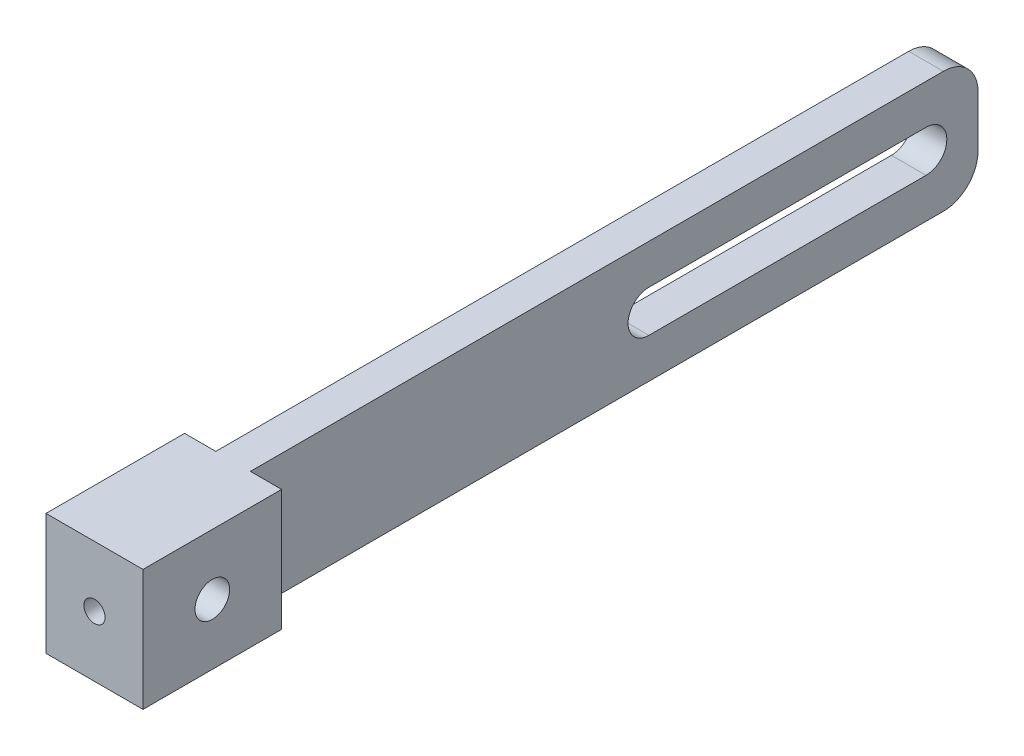
ISO-10303-21;
HEADER;
FILE_DESCRIPTION(('STEP AP214'),'2;1');
FILE_NAME('part.step','',(''),(''),'','','');
FILE_SCHEMA(('AUTOMOTIVE_DESIGN { 1 0 10303 214 1 1 1 1 }'));
ENDSEC;
DATA;
#1=APPLICATION_CONTEXT('core data for automotive mechanical design processes');
#2=APPLICATION_PROTOCOL_DEFINITION('international standard','automotive_design',2000,#1);
#3=PRODUCT_CONTEXT('',#1,'mechanical');
#4=PRODUCT('Part','Part','',(#3));
#5=PRODUCT_RELATED_PRODUCT_CATEGORY('part','',(#4));
#6=PRODUCT_DEFINITION_FORMATION('','',#4);
#7=PRODUCT_DEFINITION_CONTEXT('part definition',#1,'design');
#8=PRODUCT_DEFINITION('design','',#6,#7);
#9=PRODUCT_DEFINITION_SHAPE('','',#8);
#10=(LENGTH_UNIT() NAMED_UNIT(*) SI_UNIT(.MILLI.,.METRE.));
#11=(NAMED_UNIT(*) PLANE_ANGLE_UNIT() SI_UNIT($,.RADIAN.));
#12=(NAMED_UNIT(*) SI_UNIT($,.STERADIAN.) SOLID_ANGLE_UNIT());
#13=UNCERTAINTY_MEASURE_WITH_UNIT(LENGTH_MEASURE(1.E-05),#10,'distance_accuracy_value','');
#14=(GEOMETRIC_REPRESENTATION_CONTEXT(3) GLOBAL_UNCERTAINTY_ASSIGNED_CONTEXT((#13)) GLOBAL_UNIT_ASSIGNED_CONTEXT((#10,
#11,#12)) REPRESENTATION_CONTEXT('',''));
#15=CARTESIAN_POINT('',(0.,0.,0.));
#16=DIRECTION('',(0.,0.,1.));
#17=DIRECTION('',(1.,0.,0.));
#18=AXIS2_PLACEMENT_3D('',#15,#16,#17);
#19=CARTESIAN_POINT('',(0.,0.,-40.));
#20=DIRECTION('',(0.,0.,1.));
#21=DIRECTION('',(1.,0.,0.));
#22=AXIS2_PLACEMENT_3D('',#19,#20,#21);
#23=PLANE('',#22);
#24=DIRECTION('',(0.,-1.,0.));
#25=VECTOR('',#24,1.);
#26=CARTESIAN_POINT('',(5.,17.5,-40.));
#27=LINE('',#26,#25);
#28=CARTESIAN_POINT('',(5.,17.5,-40.));
#29=VERTEX_POINT('',#28);
#30=CARTESIAN_POINT('',(5.,-17.5,-40.));
#31=VERTEX_POINT('',#30);
#32=EDGE_CURVE('E169',#29,#31,#27,.T.);
#33=ORIENTED_EDGE('',*,*,#32,.F.);
#34=DIRECTION('',(-1.,0.,0.));
#35=VECTOR('',#34,1.);
#36=CARTESIAN_POINT('',(-14.,17.5,-40.));
#37=LINE('',#36,#35);
#38=CARTESIAN_POINT('',(14.,17.5,-40.));
#39=VERTEX_POINT('',#38);
#40=EDGE_CURVE('E222',#39,#29,#37,.T.);
#41=ORIENTED_EDGE('',*,*,#40,.F.);
#42=DIRECTION('',(0.,1.,0.));
#43=VECTOR('',#42,1.);
#44=CARTESIAN_POINT('',(14.,17.5,-40.));
#45=LINE('',#44,#43);
#46=CARTESIAN_POINT('',(14.,-17.5,-40.));
#47=VERTEX_POINT('',#46);
#48=EDGE_CURVE('E217',#47,#39,#45,.T.);
#49=ORIENTED_EDGE('',*,*,#48,.F.);
#50=DIRECTION('',(1.,0.,0.));
#51=VECTOR('',#50,1.);
#52=CARTESIAN_POINT('',(-14.,-17.5,-40.));
#53=LINE('',#52,#51);
#54=EDGE_CURVE('E228',#31,#47,#53,.T.);
#55=ORIENTED_EDGE('',*,*,#54,.F.);
#56=EDGE_LOOP('',(#33,#41,#49,#55));
#57=FACE_BOUND('',#56,.T.);
#58=ADVANCED_FACE('F37',(#57),#23,.F.);
#59=CARTESIAN_POINT('',(0.,0.,-40.));
#60=DIRECTION('',(0.,0.,1.));
#61=DIRECTION('',(1.,0.,0.));
#62=AXIS2_PLACEMENT_3D('',#59,#60,#61);
#63=CYLINDRICAL_SURFACE('',#62,3.05);
#64=CARTESIAN_POINT('',(3.05,0.,-25.));
#65=CARTESIAN_POINT('',(3.04999894656967,0.0778388516711993,-24.9999990776582));
#66=CARTESIAN_POINT('',(3.04701357586744,0.155694223240466,-24.9981761128476));
#67=CARTESIAN_POINT('',(3.03512321249011,0.310794901911584,-24.9909373572053));
#68=CARTESIAN_POINT('',(3.02621510973629,0.388039866908199,-24.985519678761));
#69=CARTESIAN_POINT('',(2.99071490170113,0.618203647339813,-24.9640191829666));
#70=CARTESIAN_POINT('',(2.95534719367242,0.769394828397861,-24.9426892638166));
#71=CARTESIAN_POINT('',(2.86329217582679,1.06184403182779,-24.8882091649048));
#72=CARTESIAN_POINT('',(2.80671057271342,1.20314724922889,-24.8551176339032));
#73=CARTESIAN_POINT('',(2.67451304885061,1.47382634240365,-24.7799128481737));
#74=CARTESIAN_POINT('',(2.59890078696826,1.60320450438382,-24.737801327876));
#75=CARTESIAN_POINT('',(2.4242624951777,1.85771546961127,-24.6442100280389));
#76=CARTESIAN_POINT('',(2.32387187455578,1.98173347876208,-24.5922561307158));
#77=CARTESIAN_POINT('',(2.10562192933092,2.21226040779694,-24.4857621209461));
#78=CARTESIAN_POINT('',(1.98773977527488,2.31874605590541,-24.4312186929527));
#79=CARTESIAN_POINT('',(1.72017260685597,2.52499231178169,-24.3174036089768));
#80=CARTESIAN_POINT('',(1.56834873498458,2.62215822454236,-24.2584174550907));
#81=CARTESIAN_POINT('',(1.24706183060992,2.78926152781662,-24.1508950084576));
#82=CARTESIAN_POINT('',(1.07762853689129,2.8592439083724,-24.1023415092093));
#83=CARTESIAN_POINT('',(0.76882879703017,2.95476494598714,-24.0338472934209));
#84=CARTESIAN_POINT('',(0.632459120740937,2.98702727840751,-24.0097941340365));
#85=CARTESIAN_POINT('',(0.354951598144106,3.03252587878817,-23.975503587789));
#86=CARTESIAN_POINT('',(0.213820241570525,3.04578705029111,-23.965248118301));
#87=CARTESIAN_POINT('',(-0.0695169186428372,3.05250587846758,-23.960079848663));
#88=CARTESIAN_POINT('',(-0.211724405724443,3.04591978324775,-23.9652009449729));
#89=CARTESIAN_POINT('',(-0.49261590175361,3.01328022799258,-23.9900548764776));
#90=CARTESIAN_POINT('',(-0.631297101089209,2.98721171847245,-24.0097990073498));
#91=CARTESIAN_POINT('',(-0.899350863065865,2.91762708645337,-24.060695419486));
#92=CARTESIAN_POINT('',(-1.02883998193187,2.87440874414838,-24.0916522481557));
#93=CARTESIAN_POINT('',(-1.27904158300631,2.77215505173565,-24.1616087634001));
#94=CARTESIAN_POINT('',(-1.39975087665567,2.71311399141532,-24.2006113524125));
#95=CARTESIAN_POINT('',(-1.65202957244851,2.56866691324738,-24.290735982823));
#96=CARTESIAN_POINT('',(-1.78165131294036,2.48042947130343,-24.3427763406625));
#97=CARTESIAN_POINT('',(-2.0256128962995,2.28556878071315,-24.448427261534));
#98=CARTESIAN_POINT('',(-2.13993745013053,2.17892737802416,-24.5020393311719));
#99=CARTESIAN_POINT('',(-2.3674687629059,1.93128100554039,-24.6142383852992));
#100=CARTESIAN_POINT('',(-2.47796280565978,1.78752282510817,-24.6723738741415));
#101=CARTESIAN_POINT('',(-2.62415729410356,1.55711280718039,-24.7520579536408));
#102=CARTESIAN_POINT('',(-2.66964759571858,1.47780710253188,-24.7773761234304));
#103=CARTESIAN_POINT('',(-2.75363494715547,1.31468398559502,-24.8248107913834));
#104=CARTESIAN_POINT('',(-2.79213630506512,1.2308693942443,-24.8469292601702));
#105=CARTESIAN_POINT('',(-2.8595753127702,1.06438345561977,-24.8860991069124));
#106=CARTESIAN_POINT('',(-2.88894486907926,0.981939343514416,-24.9033732662594));
#107=CARTESIAN_POINT('',(-2.94062446133058,0.814201359749336,-24.93399826167));
#108=CARTESIAN_POINT('',(-2.9629384997356,0.728909134244006,-24.9473513217917));
#109=CARTESIAN_POINT('',(-3.00015057201688,0.55622461225736,-24.9697264384757));
#110=CARTESIAN_POINT('',(-3.01505450363971,0.468834044124563,-24.9787519391629));
#111=CARTESIAN_POINT('',(-3.0372141666419,0.292772112984459,-24.9922036848332));
#112=CARTESIAN_POINT('',(-3.0444710614773,0.20410094689494,-24.9966306294609));
#113=CARTESIAN_POINT('',(-3.05357958135505,-0.0374310089007928,-25.0021787195112));
#114=CARTESIAN_POINT('',(-3.04783731596421,-0.190780141649155,-24.9986613208267));
#115=CARTESIAN_POINT('',(-3.01362121128961,-0.493851525308604,-24.9778751261289));
#116=CARTESIAN_POINT('',(-2.985148221345,-0.643573911518606,-24.9606068439208));
#117=CARTESIAN_POINT('',(-2.90814523739351,-0.930945744841672,-24.9146605732722));
#118=CARTESIAN_POINT('',(-2.86024135256526,-1.0688224553709,-24.8863397160662));
#119=CARTESIAN_POINT('',(-2.7463652118967,-1.33450083560471,-24.8205669575953));
#120=CARTESIAN_POINT('',(-2.68038962678975,-1.46230064329514,-24.7831133739897));
#121=CARTESIAN_POINT('',(-2.52470605877162,-1.71845326195858,-24.697550024097));
#122=CARTESIAN_POINT('',(-2.43325424821897,-1.84550891661981,-24.6487402116867));
#123=CARTESIAN_POINT('',(-2.23296548945765,-2.08340867478271,-24.5471070384057));
#124=CARTESIAN_POINT('',(-2.12410854289976,-2.19423384550975,-24.4942790977981));
#125=CARTESIAN_POINT('',(-1.87485701591362,-2.41214495906877,-24.3816159904911));
#126=CARTESIAN_POINT('',(-1.73218582108982,-2.51665600033266,-24.3218085480598));
#127=CARTESIAN_POINT('',(-1.42883411005663,-2.70042681573953,-24.2094309196398));
#128=CARTESIAN_POINT('',(-1.26817037069398,-2.7797098526048,-24.1568540918626));
#129=CARTESIAN_POINT('',(-0.967811098808388,-2.89584206509651,-24.0765160823178));
#130=CARTESIAN_POINT('',(-0.831011014232546,-2.93814563830721,-24.045850972745));
#131=CARTESIAN_POINT('',(-0.550685762079174,-3.00331160590618,-23.9977232154527));
#132=CARTESIAN_POINT('',(-0.40717076935868,-3.02620246945419,-23.9802412385693));
#133=CARTESIAN_POINT('',(-0.116589667042718,-3.05127030052332,-23.961063753036));
#134=CARTESIAN_POINT('',(0.0304894511583799,-3.05335419490429,-23.9594391779875));
#135=CARTESIAN_POINT('',(0.322728247030391,-3.03641076550812,-23.9724434933097));
#136=CARTESIAN_POINT('',(0.4678869731569,-3.01737334551542,-23.9870801567321));
#137=CARTESIAN_POINT('',(0.743280755079881,-2.96118372484489,-24.0289578625157));
#138=CARTESIAN_POINT('',(0.873887319322046,-2.92519758559456,-24.055382459506));
#139=CARTESIAN_POINT('',(1.12724320308159,-2.83722175422176,-24.1174091917778));
#140=CARTESIAN_POINT('',(1.24998947120979,-2.78522589203121,-24.1530148645389));
#141=CARTESIAN_POINT('',(1.50406221020719,-2.65771452109542,-24.2359367382608));
#142=CARTESIAN_POINT('',(1.63388453225799,-2.57983282312906,-24.2842094183291));
#143=CARTESIAN_POINT('',(1.87990461154634,-2.4064770235171,-24.3839342199431));
#144=CARTESIAN_POINT('',(1.99609095111143,-2.31098834878448,-24.4353889516149));
#145=CARTESIAN_POINT('',(2.23273974355442,-2.08533996751824,-24.5464102054233));
#146=CARTESIAN_POINT('',(2.35030904432298,-1.95203482423637,-24.605797740195));
#147=CARTESIAN_POINT('',(2.5618055834672,-1.66474963264468,-24.717231280435));
#148=CARTESIAN_POINT('',(2.65572209756504,-1.51076025435592,-24.7692739510251));
#149=CARTESIAN_POINT('',(2.77514063979819,-1.26847855757466,-24.8371354492502));
#150=CARTESIAN_POINT('',(2.81114365981228,-1.18660863756915,-24.8579151102344));
#151=CARTESIAN_POINT('',(2.87603691812807,-1.01928734613844,-24.8957520428367));
#152=CARTESIAN_POINT('',(2.90493130064199,-0.933838095569138,-24.912811482617));
#153=CARTESIAN_POINT('',(2.9551004726418,-0.760277502647625,-24.9426424578815));
#154=CARTESIAN_POINT('',(2.97639688671012,-0.672174501946387,-24.9554261559583));
#155=CARTESIAN_POINT('',(3.01110554697043,-0.493936394662623,-24.9763503918838));
#156=CARTESIAN_POINT('',(3.02452406561994,-0.40380296426977,-24.9844946235672));
#157=CARTESIAN_POINT('',(3.03924560653758,-0.261183903496865,-24.9934455038131));
#158=CARTESIAN_POINT('',(3.04327549236786,-0.209064530952997,-24.9959004474968));
#159=CARTESIAN_POINT('',(3.0486531111284,-0.104632599925111,-24.9991780469491));
#160=CARTESIAN_POINT('',(3.05000070807196,-0.0523200317811565,-25.0000006199597));
#161=CARTESIAN_POINT('',(3.05,0.,-25.));
#162=B_SPLINE_CURVE_WITH_KNOTS('',3,(#64,#65,#66,#67,#68,#69,#70,#71,#72,#73,#74,#75,#76,#77,
#78,#79,#80,#81,#82,#83,#84,#85,#86,#87,#88,#89,#90,#91,#92,#93,#94,#95,#96,#97,#98,#99,#100,
#101,#102,#103,#104,#105,#106,#107,#108,#109,#110,#111,#112,#113,#114,#115,#116,#117,#118,#119,
#120,#121,#122,#123,#124,#125,#126,#127,#128,#129,#130,#131,#132,#133,#134,#135,#136,#137,#138,
#139,#140,#141,#142,#143,#144,#145,#146,#147,#148,#149,#150,#151,#152,#153,#154,#155,#156,#157,
#158,#159,#160,#161),.UNSPECIFIED.,.T.,.F.,(4,2,2,2,2,2,2,2,2,2,2,2,2,2,2,2,2,2,2,2,2,2,2,2,2,2,
2,2,2,2,2,2,2,2,2,2,2,2,2,2,2,2,2,2,2,2,2,2,4),(0.,0.233458535021085,0.467039758096772,
0.934665170810636,1.39999076995564,1.86522697305303,2.36668526169528,2.86880389210039,
3.43503441191022,4.0003237590692,4.42508135522067,4.84928173935709,5.27441792673392,
5.69988285684875,6.11826261906277,6.53679357287522,7.03055085150837,7.52479799575648,
8.09280088938958,8.37706631818942,8.66115592212054,8.92838944484469,9.19547109789617,
9.4623398374726,9.72916796852226,10.1871029137378,10.6450207489018,11.0892268578409,
11.5335148559414,12.0235349878701,12.5141222490531,13.071668533087,13.6286992042349,
14.0662357684013,14.5031295606067,14.9419767827822,15.3810338690676,15.7935186376559,
16.2061625752357,16.6811305447033,17.1564934187631,17.7161246849021,18.2760092353615,
18.5511187684318,18.8260675353322,19.1002274076633,19.3741686941332,19.5310818358763,
19.6880029325991),.UNSPECIFIED.);
#163=CARTESIAN_POINT('',(3.05,0.,-25.));
#164=VERTEX_POINT('',#163);
#165=EDGE_CURVE('E216',#164,#164,#162,.T.);
#166=ORIENTED_EDGE('',*,*,#165,.T.);
#167=EDGE_LOOP('',(#166));
#168=FACE_BOUND('',#167,.T.);
#169=CARTESIAN_POINT('',(0.,0.,-40.));
#170=DIRECTION('',(0.,0.,1.));
#171=DIRECTION('',(1.,0.,0.));
#172=AXIS2_PLACEMENT_3D('',#169,#170,#171);
#173=CIRCLE('',#172,3.05);
#174=CARTESIAN_POINT('',(3.05,0.,-40.));
#175=VERTEX_POINT('',#174);
#176=EDGE_CURVE('E209',#175,#175,#173,.T.);
#177=ORIENTED_EDGE('',*,*,#176,.F.);
#178=EDGE_LOOP('',(#177));
#179=FACE_BOUND('',#178,.T.);
#180=ADVANCED_FACE('F301',(#168,#179),#63,.F.);
#181=CARTESIAN_POINT('',(14.,17.5,-40.));
#182=DIRECTION('',(1.,0.,0.));
#183=DIRECTION('',(0.,1.,0.));
#184=AXIS2_PLACEMENT_3D('',#181,#182,#183);
#185=PLANE('',#184);
#186=CARTESIAN_POINT('',(14.,0.,-20.));
#187=DIRECTION('',(1.,0.,0.));
#188=DIRECTION('',(0.,0.,-1.));
#189=AXIS2_PLACEMENT_3D('',#186,#187,#188);
#190=CIRCLE('',#189,4.99999999999999);
#191=CARTESIAN_POINT('',(14.,0.,-25.));
#192=VERTEX_POINT('',#191);
#193=EDGE_CURVE('E202',#192,#192,#190,.T.);
#194=ORIENTED_EDGE('',*,*,#193,.F.);
#195=EDGE_LOOP('',(#194));
#196=FACE_BOUND('',#195,.T.);
#197=DIRECTION('',(0.,1.,0.));
#198=VECTOR('',#197,1.);
#199=CARTESIAN_POINT('',(14.,17.5,0.));
#200=LINE('',#199,#198);
#201=CARTESIAN_POINT('',(14.,-17.5,0.));
#202=VERTEX_POINT('',#201);
#203=CARTESIAN_POINT('',(14.,17.5,0.));
#204=VERTEX_POINT('',#203);
#205=EDGE_CURVE('E212',#202,#204,#200,.T.);
#206=ORIENTED_EDGE('',*,*,#205,.F.);
#207=DIRECTION('',(0.,0.,1.));
#208=VECTOR('',#207,1.);
#209=CARTESIAN_POINT('',(14.,-17.5,-40.));
#210=LINE('',#209,#208);
#211=EDGE_CURVE('E243',#47,#202,#210,.T.);
#212=ORIENTED_EDGE('',*,*,#211,.F.);
#213=ORIENTED_EDGE('',*,*,#48,.T.);
#214=DIRECTION('',(0.,0.,1.));
#215=VECTOR('',#214,1.);
#216=CARTESIAN_POINT('',(14.,17.5,-40.));
#217=LINE('',#216,#215);
#218=EDGE_CURVE('E232',#39,#204,#217,.T.);
#219=ORIENTED_EDGE('',*,*,#218,.T.);
#220=EDGE_LOOP('',(#206,#212,#213,#219));
#221=FACE_BOUND('',#220,.T.);
#222=ADVANCED_FACE('F307',(#196,#221),#185,.T.);
#223=CARTESIAN_POINT('',(-14.,-17.5,-40.));
#224=DIRECTION('',(0.,-1.,0.));
#225=DIRECTION('',(0.,0.,-1.));
#226=AXIS2_PLACEMENT_3D('',#223,#224,#225);
#227=PLANE('',#226);
#228=DIRECTION('',(0.,0.,-1.));
#229=VECTOR('',#228,1.);
#230=CARTESIAN_POINT('',(-5.,-17.5,-40.));
#231=LINE('',#230,#229);
#232=CARTESIAN_POINT('',(-5.,-17.5,-40.));
#233=VERTEX_POINT('',#232);
#234=CARTESIAN_POINT('',(-5.,-17.5,-240.));
#235=VERTEX_POINT('',#234);
#236=EDGE_CURVE('E195',#233,#235,#231,.T.);
#237=ORIENTED_EDGE('',*,*,#236,.T.);
#238=DIRECTION('',(1.,0.,0.));
#239=VECTOR('',#238,1.);
#240=CARTESIAN_POINT('',(-14.,-17.5,-240.));
#241=LINE('',#240,#239);
#242=CARTESIAN_POINT('',(5.,-17.5,-240.));
#243=VERTEX_POINT('',#242);
#244=EDGE_CURVE('E245',#235,#243,#241,.T.);
#245=ORIENTED_EDGE('',*,*,#244,.T.);
#246=DIRECTION('',(0.,0.,-1.));
#247=VECTOR('',#246,1.);
#248=CARTESIAN_POINT('',(5.,-17.5,-40.));
#249=LINE('',#248,#247);
#250=EDGE_CURVE('E172',#31,#243,#249,.T.);
#251=ORIENTED_EDGE('',*,*,#250,.F.);
#252=ORIENTED_EDGE('',*,*,#54,.T.);
#253=ORIENTED_EDGE('',*,*,#211,.T.);
#254=DIRECTION('',(1.,0.,0.));
#255=VECTOR('',#254,1.);
#256=CARTESIAN_POINT('',(-14.,-17.5,0.));
#257=LINE('',#256,#255);
#258=CARTESIAN_POINT('',(-14.,-17.5,0.));
#259=VERTEX_POINT('',#258);
#260=EDGE_CURVE('E221',#259,#202,#257,.T.);
#261=ORIENTED_EDGE('',*,*,#260,.F.);
#262=DIRECTION('',(0.,0.,1.));
#263=VECTOR('',#262,1.);
#264=CARTESIAN_POINT('',(-14.,-17.5,-40.));
#265=LINE('',#264,#263);
#266=CARTESIAN_POINT('',(-14.,-17.5,-40.));
#267=VERTEX_POINT('',#266);
#268=EDGE_CURVE('E246',#267,#259,#265,.T.);
#269=ORIENTED_EDGE('',*,*,#268,.F.);
#270=EDGE_CURVE('E229',#267,#233,#53,.T.);
#271=ORIENTED_EDGE('',*,*,#270,.T.);
#272=EDGE_LOOP('',(#237,#245,#251,#252,#253,#261,#269,#271));
#273=FACE_BOUND('',#272,.T.);
#274=ADVANCED_FACE('F339',(#273),#227,.T.);
#275=CARTESIAN_POINT('',(-14.,17.5,-40.));
#276=DIRECTION('',(-1.,0.,0.));
#277=DIRECTION('',(0.,-1.,0.));
#278=AXIS2_PLACEMENT_3D('',#275,#276,#277);
#279=PLANE('',#278);
#280=CARTESIAN_POINT('',(-14.,0.,-20.));
#281=DIRECTION('',(1.,0.,0.));
#282=DIRECTION('',(0.,0.,-1.));
#283=AXIS2_PLACEMENT_3D('',#280,#281,#282);
#284=CIRCLE('',#283,4.99999999999999);
#285=CARTESIAN_POINT('',(-14.,0.,-25.));
#286=VERTEX_POINT('',#285);
#287=EDGE_CURVE('E205',#286,#286,#284,.T.);
#288=ORIENTED_EDGE('',*,*,#287,.T.);
#289=EDGE_LOOP('',(#288));
#290=FACE_BOUND('',#289,.T.);
#291=DIRECTION('',(0.,-1.,0.));
#292=VECTOR('',#291,1.);
#293=CARTESIAN_POINT('',(-14.,17.5,0.));
#294=LINE('',#293,#292);
#295=CARTESIAN_POINT('',(-14.,17.5,0.));
#296=VERTEX_POINT('',#295);
#297=EDGE_CURVE('E238',#296,#259,#294,.T.);
#298=ORIENTED_EDGE('',*,*,#297,.F.);
#299=DIRECTION('',(0.,0.,1.));
#300=VECTOR('',#299,1.);
#301=CARTESIAN_POINT('',(-14.,17.5,-40.));
#302=LINE('',#301,#300);
#303=CARTESIAN_POINT('',(-14.,17.5,-40.));
#304=VERTEX_POINT('',#303);
#305=EDGE_CURVE('E248',#304,#296,#302,.T.);
#306=ORIENTED_EDGE('',*,*,#305,.F.);
#307=DIRECTION('',(0.,-1.,0.));
#308=VECTOR('',#307,1.);
#309=CARTESIAN_POINT('',(-14.,17.5,-40.));
#310=LINE('',#309,#308);
#311=EDGE_CURVE('E225',#304,#267,#310,.T.);
#312=ORIENTED_EDGE('',*,*,#311,.T.);
#313=ORIENTED_EDGE('',*,*,#268,.T.);
#314=EDGE_LOOP('',(#298,#306,#312,#313));
#315=FACE_BOUND('',#314,.T.);
#316=ADVANCED_FACE('F320',(#290,#315),#279,.T.);
#317=CARTESIAN_POINT('',(-14.,17.5,-40.));
#318=DIRECTION('',(0.,1.,0.));
#319=DIRECTION('',(0.,0.,1.));
#320=AXIS2_PLACEMENT_3D('',#317,#318,#319);
#321=PLANE('',#320);
#322=DIRECTION('',(0.,0.,1.));
#323=VECTOR('',#322,1.);
#324=CARTESIAN_POINT('',(5.,17.5,-40.));
#325=LINE('',#324,#323);
#326=CARTESIAN_POINT('',(5.,17.5,-240.));
#327=VERTEX_POINT('',#326);
#328=EDGE_CURVE('E178',#327,#29,#325,.T.);
#329=ORIENTED_EDGE('',*,*,#328,.F.);
#330=DIRECTION('',(1.,0.,0.));
#331=VECTOR('',#330,1.);
#332=CARTESIAN_POINT('',(-14.,17.5,-240.));
#333=LINE('',#332,#331);
#334=CARTESIAN_POINT('',(-5.,17.5,-240.));
#335=VERTEX_POINT('',#334);
#336=EDGE_CURVE('E11',#327,#335,#333,.F.);
#337=ORIENTED_EDGE('',*,*,#336,.T.);
#338=DIRECTION('',(0.,0.,1.));
#339=VECTOR('',#338,1.);
#340=CARTESIAN_POINT('',(-5.,17.5,-40.));
#341=LINE('',#340,#339);
#342=CARTESIAN_POINT('',(-5.,17.5,-40.));
#343=VERTEX_POINT('',#342);
#344=EDGE_CURVE('E200',#335,#343,#341,.T.);
#345=ORIENTED_EDGE('',*,*,#344,.T.);
#346=EDGE_CURVE('E220',#343,#304,#37,.T.);
#347=ORIENTED_EDGE('',*,*,#346,.T.);
#348=ORIENTED_EDGE('',*,*,#305,.T.);
#349=DIRECTION('',(-1.,0.,0.));
#350=VECTOR('',#349,1.);
#351=CARTESIAN_POINT('',(-14.,17.5,0.));
#352=LINE('',#351,#350);
#353=EDGE_CURVE('E235',#204,#296,#352,.T.);
#354=ORIENTED_EDGE('',*,*,#353,.F.);
#355=ORIENTED_EDGE('',*,*,#218,.F.);
#356=ORIENTED_EDGE('',*,*,#40,.T.);
#357=EDGE_LOOP('',(#329,#337,#345,#347,#348,#354,#355,#356));
#358=FACE_BOUND('',#357,.T.);
#359=ADVANCED_FACE('F313',(#358),#321,.T.);
#360=ORIENTED_EDGE('',*,*,#346,.F.);
#361=DIRECTION('',(0.,-1.,0.));
#362=VECTOR('',#361,1.);
#363=CARTESIAN_POINT('',(-5.,17.5,-40.));
#364=LINE('',#363,#362);
#365=EDGE_CURVE('E189',#343,#233,#364,.T.);
#366=ORIENTED_EDGE('',*,*,#365,.T.);
#367=ORIENTED_EDGE('',*,*,#270,.F.);
#368=ORIENTED_EDGE('',*,*,#311,.F.);
#369=EDGE_LOOP('',(#360,#366,#367,#368));
#370=FACE_BOUND('',#369,.T.);
#371=ADVANCED_FACE('F303',(#370),#23,.F.);
#372=CARTESIAN_POINT('',(0.,0.,0.));
#373=DIRECTION('',(0.,0.,1.));
#374=DIRECTION('',(1.,0.,0.));
#375=AXIS2_PLACEMENT_3D('',#372,#373,#374);
#376=PLANE('',#375);
#377=CARTESIAN_POINT('',(0.,0.,0.));
#378=DIRECTION('',(0.,0.,1.));
#379=DIRECTION('',(1.,0.,0.));
#380=AXIS2_PLACEMENT_3D('',#377,#378,#379);
#381=CIRCLE('',#380,3.05);
#382=CARTESIAN_POINT('',(3.05,0.,0.));
#383=VERTEX_POINT('',#382);
#384=EDGE_CURVE('E213',#383,#383,#381,.T.);
#385=ORIENTED_EDGE('',*,*,#384,.F.);
#386=EDGE_LOOP('',(#385));
#387=FACE_BOUND('',#386,.T.);
#388=ORIENTED_EDGE('',*,*,#205,.T.);
#389=ORIENTED_EDGE('',*,*,#353,.T.);
#390=ORIENTED_EDGE('',*,*,#297,.T.);
#391=ORIENTED_EDGE('',*,*,#260,.T.);
#392=EDGE_LOOP('',(#388,#389,#390,#391));
#393=FACE_BOUND('',#392,.T.);
#394=ADVANCED_FACE('F312',(#387,#393),#376,.T.);
#395=CARTESIAN_POINT('',(3.05,0.,-15.));
#396=CARTESIAN_POINT('',(3.04999894656967,-0.0778388516711908,-15.0000009223418));
#397=CARTESIAN_POINT('',(3.04701357586744,-0.155694223240457,-15.0018238871524));
#398=CARTESIAN_POINT('',(3.03512321249011,-0.310794901911576,-15.0090626427947));
#399=CARTESIAN_POINT('',(3.02621510973629,-0.38803986690819,-15.014480321239));
#400=CARTESIAN_POINT('',(2.99071490170113,-0.618203647339804,-15.0359808170334));
#401=CARTESIAN_POINT('',(2.95534719367242,-0.769394828397853,-15.0573107361833));
#402=CARTESIAN_POINT('',(2.86329217582679,-1.06184403182778,-15.1117908350952));
#403=CARTESIAN_POINT('',(2.80671057271342,-1.20314724922888,-15.1448823660967));
#404=CARTESIAN_POINT('',(2.67451304885061,-1.47382634240364,-15.2200871518262));
#405=CARTESIAN_POINT('',(2.59890078696826,-1.60320450438381,-15.262198672124));
#406=CARTESIAN_POINT('',(2.4242624951777,-1.85771546961126,-15.3557899719611));
#407=CARTESIAN_POINT('',(2.32387187455578,-1.98173347876207,-15.4077438692842));
#408=CARTESIAN_POINT('',(2.10562192933092,-2.21226040779693,-15.5142378790538));
#409=CARTESIAN_POINT('',(1.98773977527488,-2.3187460559054,-15.5687813070473));
#410=CARTESIAN_POINT('',(1.72017260685597,-2.52499231178168,-15.6825963910232));
#411=CARTESIAN_POINT('',(1.56834873498458,-2.62215822454235,-15.7415825449093));
#412=CARTESIAN_POINT('',(1.24706183060993,-2.78926152781661,-15.8491049915424));
#413=CARTESIAN_POINT('',(1.07762853689129,-2.85924390837239,-15.8976584907906));
#414=CARTESIAN_POINT('',(0.768828797030174,-2.95476494598713,-15.9661527065791));
#415=CARTESIAN_POINT('',(0.632459120740941,-2.9870272784075,-15.9902058659635));
#416=CARTESIAN_POINT('',(0.35495159814411,-3.03252587878816,-16.0244964122109));
#417=CARTESIAN_POINT('',(0.213820241570528,-3.0457870502911,-16.034751881699));
#418=CARTESIAN_POINT('',(-0.0695169186428347,-3.05250587846757,-16.0399201513369));
#419=CARTESIAN_POINT('',(-0.21172440572444,-3.04591978324774,-16.034799055027));
#420=CARTESIAN_POINT('',(-0.492615901753608,-3.01328022799257,-16.0099451235224));
#421=CARTESIAN_POINT('',(-0.631297101089207,-2.98721171847244,-15.9902009926502));
#422=CARTESIAN_POINT('',(-0.899350863065864,-2.91762708645336,-15.939304580514));
#423=CARTESIAN_POINT('',(-1.02883998193187,-2.87440874414838,-15.9083477518443));
#424=CARTESIAN_POINT('',(-1.27904158300631,-2.77215505173564,-15.8383912365999));
#425=CARTESIAN_POINT('',(-1.39975087665566,-2.71311399141531,-15.7993886475875));
#426=CARTESIAN_POINT('',(-1.65202957244851,-2.56866691324738,-15.709264017177));
#427=CARTESIAN_POINT('',(-1.78165131294035,-2.48042947130343,-15.6572236593375));
#428=CARTESIAN_POINT('',(-2.0256128962995,-2.28556878071314,-15.551572738466));
#429=CARTESIAN_POINT('',(-2.13993745013053,-2.17892737802415,-15.497960668828));
#430=CARTESIAN_POINT('',(-2.3674687629059,-1.93128100554038,-15.3857616147008));
#431=CARTESIAN_POINT('',(-2.47796280565978,-1.78752282510816,-15.3276261258585));
#432=CARTESIAN_POINT('',(-2.62415729410356,-1.55711280718038,-15.2479420463592));
#433=CARTESIAN_POINT('',(-2.66964759571858,-1.47780710253187,-15.2226238765696));
#434=CARTESIAN_POINT('',(-2.75363494715546,-1.31468398559501,-15.1751892086166));
#435=CARTESIAN_POINT('',(-2.79213630506512,-1.23086939424429,-15.1530707398298));
#436=CARTESIAN_POINT('',(-2.8595753127702,-1.06438345561976,-15.1139008930876));
#437=CARTESIAN_POINT('',(-2.88894486907926,-0.981939343514409,-15.0966267337405));
#438=CARTESIAN_POINT('',(-2.94062446133058,-0.814201359749328,-15.06600173833));
#439=CARTESIAN_POINT('',(-2.9629384997356,-0.728909134243998,-15.0526486782082));
#440=CARTESIAN_POINT('',(-3.00015057201688,-0.556224612257352,-15.0302735615242));
#441=CARTESIAN_POINT('',(-3.01505450363971,-0.468834044124556,-15.0212480608371));
#442=CARTESIAN_POINT('',(-3.0372141666419,-0.292772112984451,-15.0077963151667));
#443=CARTESIAN_POINT('',(-3.0444710614773,-0.204100946894933,-15.0033693705391));
#444=CARTESIAN_POINT('',(-3.05357958135505,0.0374310089007995,-14.9978212804888));
#445=CARTESIAN_POINT('',(-3.0478373159642,0.190780141649161,-15.0013386791733));
#446=CARTESIAN_POINT('',(-3.01362121128961,0.493851525308611,-15.0221248738711));
#447=CARTESIAN_POINT('',(-2.985148221345,0.643573911518612,-15.0393931560792));
#448=CARTESIAN_POINT('',(-2.90814523739351,0.930945744841678,-15.0853394267278));
#449=CARTESIAN_POINT('',(-2.86024135256526,1.06882245537091,-15.1136602839338));
#450=CARTESIAN_POINT('',(-2.74636521189671,1.33450083560472,-15.1794330424047));
#451=CARTESIAN_POINT('',(-2.68038962678975,1.46230064329514,-15.2168866260103));
#452=CARTESIAN_POINT('',(-2.52470605877162,1.71845326195858,-15.3024499759029));
#453=CARTESIAN_POINT('',(-2.43325424821897,1.84550891661981,-15.3512597883133));
#454=CARTESIAN_POINT('',(-2.23296548945765,2.08340867478271,-15.4528929615942));
#455=CARTESIAN_POINT('',(-2.12410854289976,2.19423384550976,-15.5057209022019));
#456=CARTESIAN_POINT('',(-1.87485701591362,2.41214495906878,-15.6183840095089));
#457=CARTESIAN_POINT('',(-1.73218582108982,2.51665600033267,-15.6781914519402));
#458=CARTESIAN_POINT('',(-1.42883411005663,2.70042681573954,-15.7905690803602));
#459=CARTESIAN_POINT('',(-1.26817037069399,2.77970985260481,-15.8431459081374));
#460=CARTESIAN_POINT('',(-0.967811098808391,2.89584206509652,-15.9234839176822));
#461=CARTESIAN_POINT('',(-0.83101101423255,2.93814563830722,-15.954149027255));
#462=CARTESIAN_POINT('',(-0.550685762079179,3.00331160590618,-16.0022767845473));
#463=CARTESIAN_POINT('',(-0.407170769358686,3.0262024694542,-16.0197587614307));
#464=CARTESIAN_POINT('',(-0.116589667042723,3.05127030052332,-16.038936246964));
#465=CARTESIAN_POINT('',(0.0304894511583734,3.05335419490429,-16.0405608220125));
#466=CARTESIAN_POINT('',(0.322728247030383,3.03641076550812,-16.0275565066903));
#467=CARTESIAN_POINT('',(0.467886973156893,3.01737334551543,-16.0129198432679));
#468=CARTESIAN_POINT('',(0.743280755079874,2.9611837248449,-15.9710421374843));
#469=CARTESIAN_POINT('',(0.873887319322038,2.92519758559457,-15.944617540494));
#470=CARTESIAN_POINT('',(1.12724320308158,2.83722175422177,-15.8825908082222));
#471=CARTESIAN_POINT('',(1.24998947120978,2.78522589203122,-15.8469851354611));
#472=CARTESIAN_POINT('',(1.50406221020718,2.65771452109543,-15.7640632617392));
#473=CARTESIAN_POINT('',(1.63388453225798,2.57983282312908,-15.7157905816709));
#474=CARTESIAN_POINT('',(1.87990461154633,2.40647702351711,-15.6160657800569));
#475=CARTESIAN_POINT('',(1.99609095111142,2.3109883487845,-15.5646110483851));
#476=CARTESIAN_POINT('',(2.23273974355441,2.08533996751826,-15.4535897945766));
#477=CARTESIAN_POINT('',(2.35030904432297,1.95203482423639,-15.394202259805));
#478=CARTESIAN_POINT('',(2.5618055834672,1.6647496326447,-15.282768719565));
#479=CARTESIAN_POINT('',(2.65572209756503,1.51076025435594,-15.2307260489749));
#480=CARTESIAN_POINT('',(2.77514063979818,1.26847855757468,-15.1628645507497));
#481=CARTESIAN_POINT('',(2.81114365981227,1.18660863756917,-15.1420848897656));
#482=CARTESIAN_POINT('',(2.87603691812806,1.01928734613846,-15.1042479571633));
#483=CARTESIAN_POINT('',(2.90493130064199,0.933838095569157,-15.087188517383));
#484=CARTESIAN_POINT('',(2.9551004726418,0.760277502647643,-15.0573575421185));
#485=CARTESIAN_POINT('',(2.97639688671011,0.672174501946404,-15.0445738440416));
#486=CARTESIAN_POINT('',(3.01110554697043,0.493936394662641,-15.0236496081161));
#487=CARTESIAN_POINT('',(3.02452406561994,0.403802964269789,-15.0155053764328));
#488=CARTESIAN_POINT('',(3.03924560653758,0.261183903496882,-15.0065544961869));
#489=CARTESIAN_POINT('',(3.04327549236786,0.209064530953012,-15.0040995525032));
#490=CARTESIAN_POINT('',(3.0486531111284,0.104632599925122,-15.0008219530509));
#491=CARTESIAN_POINT('',(3.05000070807196,0.0523200317811661,-14.9999993800403));
#492=CARTESIAN_POINT('',(3.05,0.,-15.));
#493=B_SPLINE_CURVE_WITH_KNOTS('',3,(#395,#396,#397,#398,#399,#400,#401,#402,#403,#404,#405,
#406,#407,#408,#409,#410,#411,#412,#413,#414,#415,#416,#417,#418,#419,#420,#421,#422,#423,#424,
#425,#426,#427,#428,#429,#430,#431,#432,#433,#434,#435,#436,#437,#438,#439,#440,#441,#442,#443,
#444,#445,#446,#447,#448,#449,#450,#451,#452,#453,#454,#455,#456,#457,#458,#459,#460,#461,#462,
#463,#464,#465,#466,#467,#468,#469,#470,#471,#472,#473,#474,#475,#476,#477,#478,#479,#480,#481,
#482,#483,#484,#485,#486,#487,#488,#489,#490,#491,#492),.UNSPECIFIED.,.T.,.F.,(4,2,2,2,2,2,2,2,
2,2,2,2,2,2,2,2,2,2,2,2,2,2,2,2,2,2,2,2,2,2,2,2,2,2,2,2,2,2,2,2,2,2,2,2,2,2,2,2,4),(0.,
0.233458535021085,0.467039758096772,0.934665170810635,1.39999076995564,1.86522697305303,
2.36668526169528,2.86880389210038,3.43503441191021,4.00032375906919,4.42508135522066,
4.84928173935708,5.27441792673391,5.69988285684875,6.11826261906277,6.53679357287521,
7.03055085150837,7.52479799575648,8.09280088938958,8.37706631818942,8.66115592212054,
8.92838944484468,9.19547109789616,9.4623398374726,9.72916796852226,10.1871029137378,
10.6450207489018,11.0892268578409,11.5335148559414,12.0235349878701,12.5141222490531,
13.071668533087,13.6286992042349,14.0662357684013,14.5031295606067,14.9419767827822,
15.3810338690676,15.7935186376559,16.2061625752357,16.6811305447033,17.1564934187631,
17.7161246849021,18.2760092353615,18.5511187684318,18.8260675353322,19.1002274076633,
19.3741686941332,19.5310818358763,19.6880029325991),.UNSPECIFIED.);
#494=CARTESIAN_POINT('',(3.05,0.,-15.));
#495=VERTEX_POINT('',#494);
#496=EDGE_CURVE('E208',#495,#495,#493,.T.);
#497=ORIENTED_EDGE('',*,*,#496,.T.);
#498=EDGE_LOOP('',(#497));
#499=FACE_BOUND('',#498,.T.);
#500=ORIENTED_EDGE('',*,*,#384,.T.);
#501=EDGE_LOOP('',(#500));
#502=FACE_BOUND('',#501,.T.);
#503=ADVANCED_FACE('F262',(#499,#502),#63,.F.);
#504=CARTESIAN_POINT('',(-14.,0.,-20.));
#505=DIRECTION('',(1.,0.,0.));
#506=DIRECTION('',(0.,0.,-1.));
#507=AXIS2_PLACEMENT_3D('',#504,#505,#506);
#508=CYLINDRICAL_SURFACE('',#507,4.99999999999999);
#509=ORIENTED_EDGE('',*,*,#496,.F.);
#510=EDGE_LOOP('',(#509));
#511=FACE_BOUND('',#510,.T.);
#512=ORIENTED_EDGE('',*,*,#287,.F.);
#513=EDGE_LOOP('',(#512));
#514=FACE_BOUND('',#513,.T.);
#515=ORIENTED_EDGE('',*,*,#193,.T.);
#516=EDGE_LOOP('',(#515));
#517=FACE_BOUND('',#516,.T.);
#518=ORIENTED_EDGE('',*,*,#165,.F.);
#519=EDGE_LOOP('',(#518));
#520=FACE_BOUND('',#519,.T.);
#521=ADVANCED_FACE('F265',(#511,#514,#517,#520),#508,.F.);
#522=CARTESIAN_POINT('',(5.,0.,0.));
#523=DIRECTION('',(1.,0.,0.));
#524=DIRECTION('',(0.,0.,-1.));
#525=AXIS2_PLACEMENT_3D('',#522,#523,#524);
#526=PLANE('',#525);
#527=ORIENTED_EDGE('',*,*,#250,.T.);
#528=CARTESIAN_POINT('',(5.,-7.5,-240.));
#529=DIRECTION('',(1.,0.,0.));
#530=DIRECTION('',(0.,0.,-1.));
#531=AXIS2_PLACEMENT_3D('',#528,#529,#530);
#532=CIRCLE('',#531,10.);
#533=CARTESIAN_POINT('',(5.,-7.5,-250.));
#534=VERTEX_POINT('',#533);
#535=EDGE_CURVE('E352',#243,#534,#532,.T.);
#536=ORIENTED_EDGE('',*,*,#535,.T.);
#537=DIRECTION('',(0.,1.,0.));
#538=VECTOR('',#537,1.);
#539=CARTESIAN_POINT('',(5.,17.5,-250.));
#540=LINE('',#539,#538);
#541=CARTESIAN_POINT('',(5.,7.5,-250.));
#542=VERTEX_POINT('',#541);
#543=EDGE_CURVE('E175',#534,#542,#540,.T.);
#544=ORIENTED_EDGE('',*,*,#543,.T.);
#545=CARTESIAN_POINT('',(5.,7.5,-240.));
#546=DIRECTION('',(1.,0.,0.));
#547=DIRECTION('',(0.,0.,-1.));
#548=AXIS2_PLACEMENT_3D('',#545,#546,#547);
#549=CIRCLE('',#548,10.);
#550=EDGE_CURVE('E342',#542,#327,#549,.T.);
#551=ORIENTED_EDGE('',*,*,#550,.T.);
#552=ORIENTED_EDGE('',*,*,#328,.T.);
#553=ORIENTED_EDGE('',*,*,#32,.T.);
#554=EDGE_LOOP('',(#527,#536,#544,#551,#552,#553));
#555=FACE_BOUND('',#554,.T.);
#556=DIRECTION('',(0.,0.,1.));
#557=VECTOR('',#556,1.);
#558=CARTESIAN_POINT('',(5.,6.,-235.));
#559=LINE('',#558,#557);
#560=CARTESIAN_POINT('',(5.,6.,-235.));
#561=VERTEX_POINT('',#560);
#562=CARTESIAN_POINT('',(5.,5.99999999999999,-155.));
#563=VERTEX_POINT('',#562);
#564=EDGE_CURVE('E143',#561,#563,#559,.T.);
#565=ORIENTED_EDGE('',*,*,#564,.F.);
#566=CARTESIAN_POINT('',(5.,0.,-235.));
#567=DIRECTION('',(1.,0.,0.));
#568=DIRECTION('',(0.,0.,-1.));
#569=AXIS2_PLACEMENT_3D('',#566,#567,#568);
#570=CIRCLE('',#569,6.);
#571=CARTESIAN_POINT('',(5.,-6.,-235.));
#572=VERTEX_POINT('',#571);
#573=EDGE_CURVE('E154',#572,#561,#570,.T.);
#574=ORIENTED_EDGE('',*,*,#573,.F.);
#575=DIRECTION('',(0.,0.,-1.));
#576=VECTOR('',#575,1.);
#577=CARTESIAN_POINT('',(5.,-6.,-235.));
#578=LINE('',#577,#576);
#579=CARTESIAN_POINT('',(5.,-6.00000000000001,-155.));
#580=VERTEX_POINT('',#579);
#581=EDGE_CURVE('E165',#580,#572,#578,.T.);
#582=ORIENTED_EDGE('',*,*,#581,.F.);
#583=CARTESIAN_POINT('',(5.,0.,-155.));
#584=DIRECTION('',(1.,0.,0.));
#585=DIRECTION('',(0.,0.,-1.));
#586=AXIS2_PLACEMENT_3D('',#583,#584,#585);
#587=CIRCLE('',#586,6.);
#588=EDGE_CURVE('E163',#563,#580,#587,.T.);
#589=ORIENTED_EDGE('',*,*,#588,.F.);
#590=EDGE_LOOP('',(#565,#574,#582,#589));
#591=FACE_BOUND('',#590,.T.);
#592=ADVANCED_FACE('F161',(#555,#591),#526,.T.);
#593=CARTESIAN_POINT('',(-5.,6.,-235.));
#594=DIRECTION('',(0.,1.,0.));
#595=DIRECTION('',(0.,0.,1.));
#596=AXIS2_PLACEMENT_3D('',#593,#594,#595);
#597=PLANE('',#596);
#598=DIRECTION('',(1.,0.,0.));
#599=VECTOR('',#598,1.);
#600=CARTESIAN_POINT('',(-5.,6.,-235.));
#601=LINE('',#600,#599);
#602=CARTESIAN_POINT('',(-5.,6.,-235.));
#603=VERTEX_POINT('',#602);
#604=EDGE_CURVE('E138',#603,#561,#601,.T.);
#605=ORIENTED_EDGE('',*,*,#604,.T.);
#606=ORIENTED_EDGE('',*,*,#564,.T.);
#607=DIRECTION('',(1.,0.,0.));
#608=VECTOR('',#607,1.);
#609=CARTESIAN_POINT('',(-5.,5.99999999999999,-155.));
#610=LINE('',#609,#608);
#611=CARTESIAN_POINT('',(-5.,5.99999999999999,-155.));
#612=VERTEX_POINT('',#611);
#613=EDGE_CURVE('E150',#612,#563,#610,.T.);
#614=ORIENTED_EDGE('',*,*,#613,.F.);
#615=DIRECTION('',(0.,0.,1.));
#616=VECTOR('',#615,1.);
#617=CARTESIAN_POINT('',(-5.,6.,-235.));
#618=LINE('',#617,#616);
#619=EDGE_CURVE('E146',#603,#612,#618,.T.);
#620=ORIENTED_EDGE('',*,*,#619,.F.);
#621=EDGE_LOOP('',(#605,#606,#614,#620));
#622=FACE_BOUND('',#621,.T.);
#623=ADVANCED_FACE('F140',(#622),#597,.F.);
#624=CARTESIAN_POINT('',(-5.,0.,-155.));
#625=DIRECTION('',(1.,0.,0.));
#626=DIRECTION('',(0.,0.,-1.));
#627=AXIS2_PLACEMENT_3D('',#624,#625,#626);
#628=CYLINDRICAL_SURFACE('',#627,6.);
#629=ORIENTED_EDGE('',*,*,#613,.T.);
#630=ORIENTED_EDGE('',*,*,#588,.T.);
#631=DIRECTION('',(1.,0.,0.));
#632=VECTOR('',#631,1.);
#633=CARTESIAN_POINT('',(-5.,-6.00000000000001,-155.));
#634=LINE('',#633,#632);
#635=CARTESIAN_POINT('',(-5.,-6.00000000000001,-155.));
#636=VERTEX_POINT('',#635);
#637=EDGE_CURVE('E190',#636,#580,#634,.T.);
#638=ORIENTED_EDGE('',*,*,#637,.F.);
#639=CARTESIAN_POINT('',(-5.,0.,-155.));
#640=DIRECTION('',(1.,0.,0.));
#641=DIRECTION('',(0.,0.,-1.));
#642=AXIS2_PLACEMENT_3D('',#639,#640,#641);
#643=CIRCLE('',#642,6.);
#644=EDGE_CURVE('E183',#612,#636,#643,.T.);
#645=ORIENTED_EDGE('',*,*,#644,.F.);
#646=EDGE_LOOP('',(#629,#630,#638,#645));
#647=FACE_BOUND('',#646,.T.);
#648=ADVANCED_FACE('F289',(#647),#628,.F.);
#649=CARTESIAN_POINT('',(-5.,-6.,-235.));
#650=DIRECTION('',(0.,-1.,0.));
#651=DIRECTION('',(0.,0.,-1.));
#652=AXIS2_PLACEMENT_3D('',#649,#650,#651);
#653=PLANE('',#652);
#654=ORIENTED_EDGE('',*,*,#637,.T.);
#655=ORIENTED_EDGE('',*,*,#581,.T.);
#656=DIRECTION('',(1.,0.,0.));
#657=VECTOR('',#656,1.);
#658=CARTESIAN_POINT('',(-5.,-6.,-235.));
#659=LINE('',#658,#657);
#660=CARTESIAN_POINT('',(-5.,-6.,-235.));
#661=VERTEX_POINT('',#660);
#662=EDGE_CURVE('E156',#661,#572,#659,.T.);
#663=ORIENTED_EDGE('',*,*,#662,.F.);
#664=DIRECTION('',(0.,0.,-1.));
#665=VECTOR('',#664,1.);
#666=CARTESIAN_POINT('',(-5.,-6.,-235.));
#667=LINE('',#666,#665);
#668=EDGE_CURVE('E151',#636,#661,#667,.T.);
#669=ORIENTED_EDGE('',*,*,#668,.F.);
#670=EDGE_LOOP('',(#654,#655,#663,#669));
#671=FACE_BOUND('',#670,.T.);
#672=ADVANCED_FACE('F286',(#671),#653,.F.);
#673=CARTESIAN_POINT('',(-5.,0.,-235.));
#674=DIRECTION('',(1.,0.,0.));
#675=DIRECTION('',(0.,0.,-1.));
#676=AXIS2_PLACEMENT_3D('',#673,#674,#675);
#677=CYLINDRICAL_SURFACE('',#676,6.);
#678=ORIENTED_EDGE('',*,*,#662,.T.);
#679=ORIENTED_EDGE('',*,*,#573,.T.);
#680=ORIENTED_EDGE('',*,*,#604,.F.);
#681=CARTESIAN_POINT('',(-5.,0.,-235.));
#682=DIRECTION('',(1.,0.,0.));
#683=DIRECTION('',(0.,0.,-1.));
#684=AXIS2_PLACEMENT_3D('',#681,#682,#683);
#685=CIRCLE('',#684,6.);
#686=EDGE_CURVE('E180',#661,#603,#685,.T.);
#687=ORIENTED_EDGE('',*,*,#686,.F.);
#688=EDGE_LOOP('',(#678,#679,#680,#687));
#689=FACE_BOUND('',#688,.T.);
#690=ADVANCED_FACE('F155',(#689),#677,.F.);
#691=CARTESIAN_POINT('',(-5.,0.,0.));
#692=DIRECTION('',(1.,0.,0.));
#693=DIRECTION('',(0.,0.,-1.));
#694=AXIS2_PLACEMENT_3D('',#691,#692,#693);
#695=PLANE('',#694);
#696=ORIENTED_EDGE('',*,*,#668,.T.);
#697=ORIENTED_EDGE('',*,*,#686,.T.);
#698=ORIENTED_EDGE('',*,*,#619,.T.);
#699=ORIENTED_EDGE('',*,*,#644,.T.);
#700=EDGE_LOOP('',(#696,#697,#698,#699));
#701=FACE_BOUND('',#700,.T.);
#702=DIRECTION('',(0.,1.,0.));
#703=VECTOR('',#702,1.);
#704=CARTESIAN_POINT('',(-5.,17.5,-250.));
#705=LINE('',#704,#703);
#706=CARTESIAN_POINT('',(-5.,-7.5,-250.));
#707=VERTEX_POINT('',#706);
#708=CARTESIAN_POINT('',(-5.,7.5,-250.));
#709=VERTEX_POINT('',#708);
#710=EDGE_CURVE('E198',#707,#709,#705,.T.);
#711=ORIENTED_EDGE('',*,*,#710,.F.);
#712=CARTESIAN_POINT('',(-5.,-7.5,-240.));
#713=DIRECTION('',(1.,0.,0.));
#714=DIRECTION('',(0.,0.,-1.));
#715=AXIS2_PLACEMENT_3D('',#712,#713,#714);
#716=CIRCLE('',#715,10.);
#717=EDGE_CURVE('E45',#707,#235,#716,.F.);
#718=ORIENTED_EDGE('',*,*,#717,.T.);
#719=ORIENTED_EDGE('',*,*,#236,.F.);
#720=ORIENTED_EDGE('',*,*,#365,.F.);
#721=ORIENTED_EDGE('',*,*,#344,.F.);
#722=CARTESIAN_POINT('',(-5.,7.5,-240.));
#723=DIRECTION('',(1.,0.,0.));
#724=DIRECTION('',(0.,0.,-1.));
#725=AXIS2_PLACEMENT_3D('',#722,#723,#724);
#726=CIRCLE('',#725,10.);
#727=EDGE_CURVE('E57',#335,#709,#726,.F.);
#728=ORIENTED_EDGE('',*,*,#727,.T.);
#729=EDGE_LOOP('',(#711,#718,#719,#720,#721,#728));
#730=FACE_BOUND('',#729,.T.);
#731=ADVANCED_FACE('F279',(#701,#730),#695,.F.);
#732=CARTESIAN_POINT('',(-5.,17.5,-250.));
#733=DIRECTION('',(0.,0.,-1.));
#734=DIRECTION('',(-1.,0.,0.));
#735=AXIS2_PLACEMENT_3D('',#732,#733,#734);
#736=PLANE('',#735);
#737=ORIENTED_EDGE('',*,*,#543,.F.);
#738=DIRECTION('',(1.,0.,0.));
#739=VECTOR('',#738,1.);
#740=CARTESIAN_POINT('',(-5.,-7.5,-250.));
#741=LINE('',#740,#739);
#742=EDGE_CURVE('E347',#534,#707,#741,.F.);
#743=ORIENTED_EDGE('',*,*,#742,.T.);
#744=ORIENTED_EDGE('',*,*,#710,.T.);
#745=DIRECTION('',(1.,0.,0.));
#746=VECTOR('',#745,1.);
#747=CARTESIAN_POINT('',(-5.,7.5,-250.));
#748=LINE('',#747,#746);
#749=EDGE_CURVE('E346',#709,#542,#748,.T.);
#750=ORIENTED_EDGE('',*,*,#749,.T.);
#751=EDGE_LOOP('',(#737,#743,#744,#750));
#752=FACE_BOUND('',#751,.T.);
#753=ADVANCED_FACE('F275',(#752),#736,.T.);
#754=CARTESIAN_POINT('',(-5.,17.5,-40.));
#755=DIRECTION('',(0.,0.,1.));
#756=DIRECTION('',(0.,-1.,0.));
#757=AXIS2_PLACEMENT_3D('',#754,#755,#756);
#758=PLANE('',#757);
#759=ORIENTED_EDGE('',*,*,#176,.T.);
#760=EDGE_LOOP('',(#759));
#761=FACE_BOUND('',#760,.T.);
#762=ADVANCED_FACE('F270',(#761),#758,.T.);
#763=CARTESIAN_POINT('',(-14.,-7.5,-240.));
#764=DIRECTION('',(1.,0.,0.));
#765=DIRECTION('',(0.,0.,-1.));
#766=AXIS2_PLACEMENT_3D('',#763,#764,#765);
#767=CYLINDRICAL_SURFACE('',#766,10.);
#768=ORIENTED_EDGE('',*,*,#717,.F.);
#769=ORIENTED_EDGE('',*,*,#742,.F.);
#770=ORIENTED_EDGE('',*,*,#535,.F.);
#771=ORIENTED_EDGE('',*,*,#244,.F.);
#772=EDGE_LOOP('',(#768,#769,#770,#771));
#773=FACE_BOUND('',#772,.T.);
#774=ADVANCED_FACE('F274',(#773),#767,.T.);
#775=CARTESIAN_POINT('',(-5.,7.5,-240.));
#776=DIRECTION('',(1.,0.,0.));
#777=DIRECTION('',(0.,0.,-1.));
#778=AXIS2_PLACEMENT_3D('',#775,#776,#777);
#779=CYLINDRICAL_SURFACE('',#778,10.);
#780=ORIENTED_EDGE('',*,*,#727,.F.);
#781=ORIENTED_EDGE('',*,*,#336,.F.);
#782=ORIENTED_EDGE('',*,*,#550,.F.);
#783=ORIENTED_EDGE('',*,*,#749,.F.);
#784=EDGE_LOOP('',(#780,#781,#782,#783));
#785=FACE_BOUND('',#784,.T.);
#786=ADVANCED_FACE('F39',(#785),#779,.T.);
#787=CLOSED_SHELL('',(#58,#180,#222,#274,#316,#359,#371,#394,#503,#521,#592,#623,#648,#672,#690,
#731,#753,#762,#774,#786));
#788=MANIFOLD_SOLID_BREP('B2',#787);
#789=ADVANCED_BREP_SHAPE_REPRESENTATION('',(#18,#788),#14);
#790=SHAPE_DEFINITION_REPRESENTATION(#9,#789);
ENDSEC;
END-ISO-10303-21;
